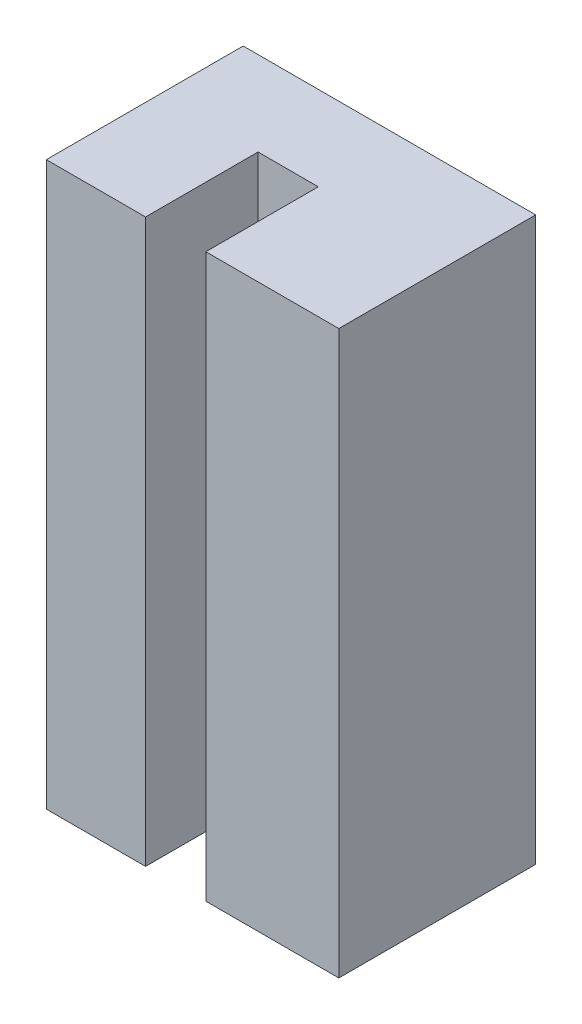
ISO-10303-21;
HEADER;
FILE_DESCRIPTION(('STEP AP214'),'2;1');
FILE_NAME('part.step','',(''),(''),'','','');
FILE_SCHEMA(('AUTOMOTIVE_DESIGN { 1 0 10303 214 1 1 1 1 }'));
ENDSEC;
DATA;
#1=APPLICATION_CONTEXT('core data for automotive mechanical design processes');
#2=APPLICATION_PROTOCOL_DEFINITION('international standard','automotive_design',2000,#1);
#3=PRODUCT_CONTEXT('',#1,'mechanical');
#4=PRODUCT('Part','Part','',(#3));
#5=PRODUCT_RELATED_PRODUCT_CATEGORY('part','',(#4));
#6=PRODUCT_DEFINITION_FORMATION('','',#4);
#7=PRODUCT_DEFINITION_CONTEXT('part definition',#1,'design');
#8=PRODUCT_DEFINITION('design','',#6,#7);
#9=PRODUCT_DEFINITION_SHAPE('','',#8);
#10=(LENGTH_UNIT() NAMED_UNIT(*) SI_UNIT(.MILLI.,.METRE.));
#11=(NAMED_UNIT(*) PLANE_ANGLE_UNIT() SI_UNIT($,.RADIAN.));
#12=(NAMED_UNIT(*) SI_UNIT($,.STERADIAN.) SOLID_ANGLE_UNIT());
#13=UNCERTAINTY_MEASURE_WITH_UNIT(LENGTH_MEASURE(1.E-05),#10,'distance_accuracy_value','');
#14=(GEOMETRIC_REPRESENTATION_CONTEXT(3) GLOBAL_UNCERTAINTY_ASSIGNED_CONTEXT((#13)) GLOBAL_UNIT_ASSIGNED_CONTEXT((#10,
#11,#12)) REPRESENTATION_CONTEXT('',''));
#15=CARTESIAN_POINT('',(0.,0.,0.));
#16=DIRECTION('',(0.,0.,1.));
#17=DIRECTION('',(1.,0.,0.));
#18=AXIS2_PLACEMENT_3D('',#15,#16,#17);
#19=CARTESIAN_POINT('',(0.,10.,0.));
#20=DIRECTION('',(0.,0.,-1.));
#21=DIRECTION('',(-1.,0.,0.));
#22=AXIS2_PLACEMENT_3D('',#19,#20,#21);
#23=PLANE('',#22);
#24=DIRECTION('',(1.,0.,0.));
#25=VECTOR('',#24,1.);
#26=CARTESIAN_POINT('',(0.,0.,0.));
#27=LINE('',#26,#25);
#28=CARTESIAN_POINT('',(0.,0.,0.));
#29=VERTEX_POINT('',#28);
#30=CARTESIAN_POINT('',(1.76407019006362,0.,0.));
#31=VERTEX_POINT('',#30);
#32=EDGE_CURVE('E134',#29,#31,#27,.T.);
#33=ORIENTED_EDGE('',*,*,#32,.T.);
#34=DIRECTION('',(0.,1.,0.));
#35=VECTOR('',#34,1.);
#36=CARTESIAN_POINT('',(1.76407019006362,0.,0.));
#37=LINE('',#36,#35);
#38=CARTESIAN_POINT('',(1.76407019006362,10.,0.));
#39=VERTEX_POINT('',#38);
#40=EDGE_CURVE('E139',#31,#39,#37,.T.);
#41=ORIENTED_EDGE('',*,*,#40,.T.);
#42=DIRECTION('',(1.,0.,0.));
#43=VECTOR('',#42,1.);
#44=CARTESIAN_POINT('',(0.,10.,0.));
#45=LINE('',#44,#43);
#46=CARTESIAN_POINT('',(0.,10.,0.));
#47=VERTEX_POINT('',#46);
#48=EDGE_CURVE('E88',#47,#39,#45,.T.);
#49=ORIENTED_EDGE('',*,*,#48,.F.);
#50=DIRECTION('',(0.,-1.,0.));
#51=VECTOR('',#50,1.);
#52=CARTESIAN_POINT('',(0.,10.,0.));
#53=LINE('',#52,#51);
#54=EDGE_CURVE('E11',#47,#29,#53,.T.);
#55=ORIENTED_EDGE('',*,*,#54,.T.);
#56=EDGE_LOOP('',(#33,#41,#49,#55));
#57=FACE_BOUND('',#56,.T.);
#58=ADVANCED_FACE('F36',(#57),#23,.F.);
#59=CARTESIAN_POINT('',(0.,10.,0.));
#60=DIRECTION('',(1.,0.,0.));
#61=DIRECTION('',(0.,0.,-1.));
#62=AXIS2_PLACEMENT_3D('',#59,#60,#61);
#63=PLANE('',#62);
#64=DIRECTION('',(0.,0.,1.));
#65=VECTOR('',#64,1.);
#66=CARTESIAN_POINT('',(0.,0.,0.));
#67=LINE('',#66,#65);
#68=CARTESIAN_POINT('',(0.,0.,-3.5));
#69=VERTEX_POINT('',#68);
#70=EDGE_CURVE('E135',#69,#29,#67,.T.);
#71=ORIENTED_EDGE('',*,*,#70,.T.);
#72=ORIENTED_EDGE('',*,*,#54,.F.);
#73=DIRECTION('',(0.,0.,1.));
#74=VECTOR('',#73,1.);
#75=CARTESIAN_POINT('',(0.,10.,0.));
#76=LINE('',#75,#74);
#77=CARTESIAN_POINT('',(0.,10.,-3.5));
#78=VERTEX_POINT('',#77);
#79=EDGE_CURVE('E145',#78,#47,#76,.T.);
#80=ORIENTED_EDGE('',*,*,#79,.F.);
#81=DIRECTION('',(0.,-1.,0.));
#82=VECTOR('',#81,1.);
#83=CARTESIAN_POINT('',(0.,10.,-3.5));
#84=LINE('',#83,#82);
#85=EDGE_CURVE('E146',#78,#69,#84,.T.);
#86=ORIENTED_EDGE('',*,*,#85,.T.);
#87=EDGE_LOOP('',(#71,#72,#80,#86));
#88=FACE_BOUND('',#87,.T.);
#89=ADVANCED_FACE('F38',(#88),#63,.F.);
#90=CARTESIAN_POINT('',(2.83519019006362,10.,0.));
#91=VERTEX_POINT('',#90);
#92=CARTESIAN_POINT('',(5.2,10.,0.));
#93=VERTEX_POINT('',#92);
#94=EDGE_CURVE('E127',#91,#93,#45,.T.);
#95=ORIENTED_EDGE('',*,*,#94,.F.);
#96=DIRECTION('',(0.,1.,0.));
#97=VECTOR('',#96,1.);
#98=CARTESIAN_POINT('',(2.83519019006362,0.,0.));
#99=LINE('',#98,#97);
#100=CARTESIAN_POINT('',(2.83519019006362,0.,0.));
#101=VERTEX_POINT('',#100);
#102=EDGE_CURVE('E114',#101,#91,#99,.T.);
#103=ORIENTED_EDGE('',*,*,#102,.F.);
#104=CARTESIAN_POINT('',(5.2,0.,0.));
#105=VERTEX_POINT('',#104);
#106=EDGE_CURVE('E125',#101,#105,#27,.T.);
#107=ORIENTED_EDGE('',*,*,#106,.T.);
#108=DIRECTION('',(0.,-1.,0.));
#109=VECTOR('',#108,1.);
#110=CARTESIAN_POINT('',(5.2,10.,0.));
#111=LINE('',#110,#109);
#112=EDGE_CURVE('E44',#93,#105,#111,.T.);
#113=ORIENTED_EDGE('',*,*,#112,.F.);
#114=EDGE_LOOP('',(#95,#103,#107,#113));
#115=FACE_BOUND('',#114,.T.);
#116=ADVANCED_FACE('F123',(#115),#23,.F.);
#117=CARTESIAN_POINT('',(5.2,10.,0.));
#118=DIRECTION('',(-1.,0.,0.));
#119=DIRECTION('',(0.,0.,1.));
#120=AXIS2_PLACEMENT_3D('',#117,#118,#119);
#121=PLANE('',#120);
#122=DIRECTION('',(0.,0.,-1.));
#123=VECTOR('',#122,1.);
#124=CARTESIAN_POINT('',(5.2,0.,0.));
#125=LINE('',#124,#123);
#126=CARTESIAN_POINT('',(5.2,0.,-3.5));
#127=VERTEX_POINT('',#126);
#128=EDGE_CURVE('E133',#105,#127,#125,.T.);
#129=ORIENTED_EDGE('',*,*,#128,.T.);
#130=DIRECTION('',(0.,-1.,0.));
#131=VECTOR('',#130,1.);
#132=CARTESIAN_POINT('',(5.2,10.,-3.5));
#133=LINE('',#132,#131);
#134=CARTESIAN_POINT('',(5.2,10.,-3.5));
#135=VERTEX_POINT('',#134);
#136=EDGE_CURVE('E148',#135,#127,#133,.T.);
#137=ORIENTED_EDGE('',*,*,#136,.F.);
#138=DIRECTION('',(0.,0.,-1.));
#139=VECTOR('',#138,1.);
#140=CARTESIAN_POINT('',(5.2,10.,0.));
#141=LINE('',#140,#139);
#142=EDGE_CURVE('E153',#93,#135,#141,.T.);
#143=ORIENTED_EDGE('',*,*,#142,.F.);
#144=ORIENTED_EDGE('',*,*,#112,.T.);
#145=EDGE_LOOP('',(#129,#137,#143,#144));
#146=FACE_BOUND('',#145,.T.);
#147=ADVANCED_FACE('F151',(#146),#121,.F.);
#148=CARTESIAN_POINT('',(0.,10.,-3.5));
#149=DIRECTION('',(0.,0.,1.));
#150=DIRECTION('',(1.,0.,0.));
#151=AXIS2_PLACEMENT_3D('',#148,#149,#150);
#152=PLANE('',#151);
#153=DIRECTION('',(-1.,0.,0.));
#154=VECTOR('',#153,1.);
#155=CARTESIAN_POINT('',(0.,0.,-3.5));
#156=LINE('',#155,#154);
#157=EDGE_CURVE('E81',#127,#69,#156,.T.);
#158=ORIENTED_EDGE('',*,*,#157,.T.);
#159=ORIENTED_EDGE('',*,*,#85,.F.);
#160=DIRECTION('',(-1.,0.,0.));
#161=VECTOR('',#160,1.);
#162=CARTESIAN_POINT('',(0.,10.,-3.5));
#163=LINE('',#162,#161);
#164=EDGE_CURVE('E60',#135,#78,#163,.T.);
#165=ORIENTED_EDGE('',*,*,#164,.F.);
#166=ORIENTED_EDGE('',*,*,#136,.T.);
#167=EDGE_LOOP('',(#158,#159,#165,#166));
#168=FACE_BOUND('',#167,.T.);
#169=ADVANCED_FACE('F175',(#168),#152,.F.);
#170=CARTESIAN_POINT('',(0.,10.,0.));
#171=DIRECTION('',(0.,-1.,0.));
#172=DIRECTION('',(0.,0.,-1.));
#173=AXIS2_PLACEMENT_3D('',#170,#171,#172);
#174=PLANE('',#173);
#175=ORIENTED_EDGE('',*,*,#48,.T.);
#176=DIRECTION('',(0.,0.,1.));
#177=VECTOR('',#176,1.);
#178=CARTESIAN_POINT('',(1.76407019006362,10.,0.));
#179=LINE('',#178,#177);
#180=CARTESIAN_POINT('',(1.76407019006362,10.,-2.00000000000002));
#181=VERTEX_POINT('',#180);
#182=EDGE_CURVE('E119',#181,#39,#179,.T.);
#183=ORIENTED_EDGE('',*,*,#182,.F.);
#184=DIRECTION('',(-1.,0.,0.));
#185=VECTOR('',#184,1.);
#186=CARTESIAN_POINT('',(0.,10.,-2.00000000000002));
#187=LINE('',#186,#185);
#188=CARTESIAN_POINT('',(2.83519019006362,10.,-2.00000000000002));
#189=VERTEX_POINT('',#188);
#190=EDGE_CURVE('E163',#189,#181,#187,.T.);
#191=ORIENTED_EDGE('',*,*,#190,.F.);
#192=DIRECTION('',(0.,0.,-1.));
#193=VECTOR('',#192,1.);
#194=CARTESIAN_POINT('',(2.83519019006362,10.,0.));
#195=LINE('',#194,#193);
#196=EDGE_CURVE('E166',#91,#189,#195,.T.);
#197=ORIENTED_EDGE('',*,*,#196,.F.);
#198=ORIENTED_EDGE('',*,*,#94,.T.);
#199=ORIENTED_EDGE('',*,*,#142,.T.);
#200=ORIENTED_EDGE('',*,*,#164,.T.);
#201=ORIENTED_EDGE('',*,*,#79,.T.);
#202=EDGE_LOOP('',(#175,#183,#191,#197,#198,#199,#200,#201));
#203=FACE_BOUND('',#202,.T.);
#204=ADVANCED_FACE('F177',(#203),#174,.F.);
#205=CARTESIAN_POINT('',(0.,0.,0.));
#206=DIRECTION('',(0.,-1.,0.));
#207=DIRECTION('',(0.,0.,-1.));
#208=AXIS2_PLACEMENT_3D('',#205,#206,#207);
#209=PLANE('',#208);
#210=DIRECTION('',(0.,0.,1.));
#211=VECTOR('',#210,1.);
#212=CARTESIAN_POINT('',(1.76407019006362,0.,0.));
#213=LINE('',#212,#211);
#214=CARTESIAN_POINT('',(1.76407019006362,0.,-2.00000000000002));
#215=VERTEX_POINT('',#214);
#216=EDGE_CURVE('E128',#215,#31,#213,.T.);
#217=ORIENTED_EDGE('',*,*,#216,.T.);
#218=ORIENTED_EDGE('',*,*,#32,.F.);
#219=ORIENTED_EDGE('',*,*,#70,.F.);
#220=ORIENTED_EDGE('',*,*,#157,.F.);
#221=ORIENTED_EDGE('',*,*,#128,.F.);
#222=ORIENTED_EDGE('',*,*,#106,.F.);
#223=DIRECTION('',(0.,0.,-1.));
#224=VECTOR('',#223,1.);
#225=CARTESIAN_POINT('',(2.83519019006362,0.,0.));
#226=LINE('',#225,#224);
#227=CARTESIAN_POINT('',(2.83519019006362,0.,-2.00000000000002));
#228=VERTEX_POINT('',#227);
#229=EDGE_CURVE('E110',#101,#228,#226,.T.);
#230=ORIENTED_EDGE('',*,*,#229,.T.);
#231=DIRECTION('',(-1.,0.,0.));
#232=VECTOR('',#231,1.);
#233=CARTESIAN_POINT('',(0.,0.,-2.00000000000002));
#234=LINE('',#233,#232);
#235=EDGE_CURVE('E51',#228,#215,#234,.T.);
#236=ORIENTED_EDGE('',*,*,#235,.T.);
#237=EDGE_LOOP('',(#217,#218,#219,#220,#221,#222,#230,#236));
#238=FACE_BOUND('',#237,.T.);
#239=ADVANCED_FACE('F132',(#238),#209,.T.);
#240=CARTESIAN_POINT('',(1.76407019006362,0.,0.));
#241=DIRECTION('',(-1.,0.,0.));
#242=DIRECTION('',(0.,0.,1.));
#243=AXIS2_PLACEMENT_3D('',#240,#241,#242);
#244=PLANE('',#243);
#245=ORIENTED_EDGE('',*,*,#182,.T.);
#246=ORIENTED_EDGE('',*,*,#40,.F.);
#247=ORIENTED_EDGE('',*,*,#216,.F.);
#248=DIRECTION('',(0.,1.,0.));
#249=VECTOR('',#248,1.);
#250=CARTESIAN_POINT('',(1.76407019006362,0.,-2.00000000000002));
#251=LINE('',#250,#249);
#252=EDGE_CURVE('E159',#215,#181,#251,.T.);
#253=ORIENTED_EDGE('',*,*,#252,.T.);
#254=EDGE_LOOP('',(#245,#246,#247,#253));
#255=FACE_BOUND('',#254,.T.);
#256=ADVANCED_FACE('F203',(#255),#244,.F.);
#257=CARTESIAN_POINT('',(0.,0.,-2.00000000000002));
#258=DIRECTION('',(0.,0.,-1.));
#259=DIRECTION('',(-1.,0.,0.));
#260=AXIS2_PLACEMENT_3D('',#257,#258,#259);
#261=PLANE('',#260);
#262=ORIENTED_EDGE('',*,*,#190,.T.);
#263=ORIENTED_EDGE('',*,*,#252,.F.);
#264=ORIENTED_EDGE('',*,*,#235,.F.);
#265=DIRECTION('',(0.,1.,0.));
#266=VECTOR('',#265,1.);
#267=CARTESIAN_POINT('',(2.83519019006362,0.,-2.00000000000002));
#268=LINE('',#267,#266);
#269=EDGE_CURVE('E116',#228,#189,#268,.T.);
#270=ORIENTED_EDGE('',*,*,#269,.T.);
#271=EDGE_LOOP('',(#262,#263,#264,#270));
#272=FACE_BOUND('',#271,.T.);
#273=ADVANCED_FACE('F211',(#272),#261,.F.);
#274=CARTESIAN_POINT('',(2.83519019006362,0.,0.));
#275=DIRECTION('',(1.,0.,0.));
#276=DIRECTION('',(0.,0.,-1.));
#277=AXIS2_PLACEMENT_3D('',#274,#275,#276);
#278=PLANE('',#277);
#279=ORIENTED_EDGE('',*,*,#196,.T.);
#280=ORIENTED_EDGE('',*,*,#269,.F.);
#281=ORIENTED_EDGE('',*,*,#229,.F.);
#282=ORIENTED_EDGE('',*,*,#102,.T.);
#283=EDGE_LOOP('',(#279,#280,#281,#282));
#284=FACE_BOUND('',#283,.T.);
#285=ADVANCED_FACE('F113',(#284),#278,.F.);
#286=CLOSED_SHELL('',(#58,#89,#116,#147,#169,#204,#239,#256,#273,#285));
#287=MANIFOLD_SOLID_BREP('B2',#286);
#288=ADVANCED_BREP_SHAPE_REPRESENTATION('',(#18,#287),#14);
#289=SHAPE_DEFINITION_REPRESENTATION(#9,#288);
ENDSEC;
END-ISO-10303-21;
